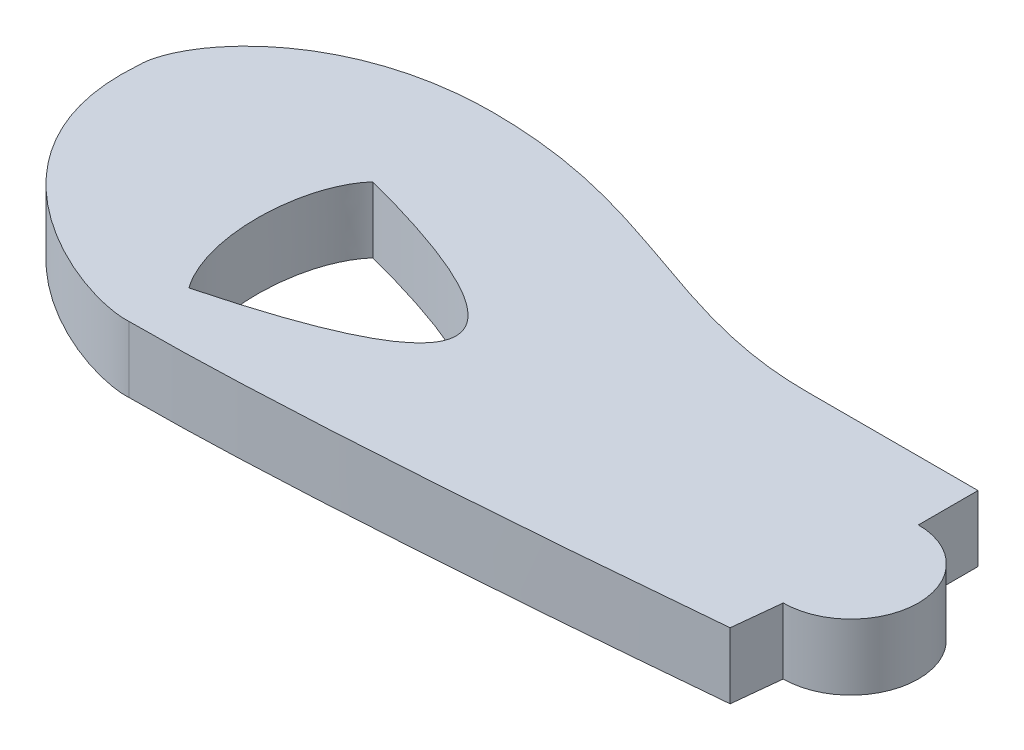
ISO-10303-21;
HEADER;
FILE_DESCRIPTION(('STEP AP214'),'2;1');
FILE_NAME('part.step','',(''),(''),'','','');
FILE_SCHEMA(('AUTOMOTIVE_DESIGN { 1 0 10303 214 1 1 1 1 }'));
ENDSEC;
DATA;
#1=APPLICATION_CONTEXT('core data for automotive mechanical design processes');
#2=APPLICATION_PROTOCOL_DEFINITION('international standard','automotive_design',2000,#1);
#3=PRODUCT_CONTEXT('',#1,'mechanical');
#4=PRODUCT('Part','Part','',(#3));
#5=PRODUCT_RELATED_PRODUCT_CATEGORY('part','',(#4));
#6=PRODUCT_DEFINITION_FORMATION('','',#4);
#7=PRODUCT_DEFINITION_CONTEXT('part definition',#1,'design');
#8=PRODUCT_DEFINITION('design','',#6,#7);
#9=PRODUCT_DEFINITION_SHAPE('','',#8);
#10=(LENGTH_UNIT() NAMED_UNIT(*) SI_UNIT(.MILLI.,.METRE.));
#11=(NAMED_UNIT(*) PLANE_ANGLE_UNIT() SI_UNIT($,.RADIAN.));
#12=(NAMED_UNIT(*) SI_UNIT($,.STERADIAN.) SOLID_ANGLE_UNIT());
#13=UNCERTAINTY_MEASURE_WITH_UNIT(LENGTH_MEASURE(1.E-05),#10,'distance_accuracy_value','');
#14=(GEOMETRIC_REPRESENTATION_CONTEXT(3) GLOBAL_UNCERTAINTY_ASSIGNED_CONTEXT((#13)) GLOBAL_UNIT_ASSIGNED_CONTEXT((#10,
#11,#12)) REPRESENTATION_CONTEXT('',''));
#15=CARTESIAN_POINT('',(0.,0.,0.));
#16=DIRECTION('',(0.,0.,1.));
#17=DIRECTION('',(1.,0.,0.));
#18=AXIS2_PLACEMENT_3D('',#15,#16,#17);
#19=CARTESIAN_POINT('',(-54.0363656247546,0.,-30.75));
#20=DIRECTION('',(0.,1.,0.));
#21=DIRECTION('',(0.,0.,1.));
#22=AXIS2_PLACEMENT_3D('',#19,#20,#21);
#23=PLANE('',#22);
#24=CARTESIAN_POINT('',(-86.5,0.,-13.95));
#25=CARTESIAN_POINT('',(-91.7174686370063,0.,-8.04051707789676));
#26=CARTESIAN_POINT('',(-91.9617677291297,0.,6.4227765229776));
#27=CARTESIAN_POINT('',(-86.5,0.,13.95));
#28=B_SPLINE_CURVE_WITH_KNOTS('',3,(#24,#25,#26,#27),.UNSPECIFIED.,.F.,.F.,(4,4),(0.,1.),.UNSPECIFIED.);
#29=CARTESIAN_POINT('',(-86.5,0.,-13.95));
#30=VERTEX_POINT('',#29);
#31=CARTESIAN_POINT('',(-86.5,0.,13.95));
#32=VERTEX_POINT('',#31);
#33=EDGE_CURVE('E317',#30,#32,#28,.T.);
#34=ORIENTED_EDGE('',*,*,#33,.T.);
#35=CARTESIAN_POINT('',(-86.5,0.,13.95));
#36=CARTESIAN_POINT('',(-33.3474120057159,0.,0.));
#37=CARTESIAN_POINT('',(-86.5,0.,-13.95));
#38=B_SPLINE_CURVE_WITH_KNOTS('',2,(#35,#36,#37),.UNSPECIFIED.,.F.,.F.,(3,3),(0.,1.),.UNSPECIFIED.);
#39=EDGE_CURVE('E308',#32,#30,#38,.T.);
#40=ORIENTED_EDGE('',*,*,#39,.T.);
#41=EDGE_LOOP('',(#34,#40));
#42=FACE_BOUND('',#41,.T.);
#43=CARTESIAN_POINT('',(0.,0.,0.));
#44=DIRECTION('',(0.,1.,0.));
#45=DIRECTION('',(0.,0.,1.));
#46=AXIS2_PLACEMENT_3D('',#43,#44,#45);
#47=CIRCLE('',#46,10.258653745374);
#48=CARTESIAN_POINT('',(0.,0.,-10.258653745374));
#49=VERTEX_POINT('',#48);
#50=CARTESIAN_POINT('',(0.,0.,10.258653745374));
#51=VERTEX_POINT('',#50);
#52=EDGE_CURVE('E121',#49,#51,#47,.F.);
#53=ORIENTED_EDGE('',*,*,#52,.T.);
#54=DIRECTION('',(-0.105174760256228,0.,0.994453754482854));
#55=VECTOR('',#54,1.);
#56=CARTESIAN_POINT('',(3.69141825415091,0.,-24.6446323021882));
#57=LINE('',#56,#55);
#58=CARTESIAN_POINT('',(-0.771119946908726,0.,17.5497863754062));
#59=VERTEX_POINT('',#58);
#60=EDGE_CURVE('E151',#51,#59,#57,.T.);
#61=ORIENTED_EDGE('',*,*,#60,.T.);
#62=CARTESIAN_POINT('',(-86.6437523296419,0.,22.899963035378));
#63=CARTESIAN_POINT('',(-83.0517217367004,0.,22.9018131310767));
#64=CARTESIAN_POINT('',(-79.4638660070371,0.,22.8366548787581));
#65=CARTESIAN_POINT('',(-72.2928525727816,0.,22.6309330547448));
#66=CARTESIAN_POINT('',(-68.709770333769,0.,22.4891582281214));
#67=CARTESIAN_POINT('',(-57.9653495358055,0.,21.9863756751028));
#68=CARTESIAN_POINT('',(-50.8087410518933,0.,21.5494482135542));
#69=CARTESIAN_POINT('',(-36.5025206195082,0.,20.5632958929387));
#70=CARTESIAN_POINT('',(-29.3530301867527,0.,20.0121206544451));
#71=CARTESIAN_POINT('',(-15.0587995532592,0.,18.8335269140399));
#72=CARTESIAN_POINT('',(-7.91409204430113,0.,18.205583695053));
#73=CARTESIAN_POINT('',(-0.771119946908726,0.,17.5497863754062));
#74=B_SPLINE_CURVE_WITH_KNOTS('',3,(#62,#63,#64,#65,#66,#67,#68,#69,#70,#71,#72,#73),
.UNSPECIFIED.,.F.,.F.,(4,2,2,2,2,4),(0.,0.125,0.25,0.5,0.75,1.),.UNSPECIFIED.);
#75=CARTESIAN_POINT('',(-86.6437523296419,0.,22.899963035378));
#76=VERTEX_POINT('',#75);
#77=EDGE_CURVE('E210',#76,#59,#74,.T.);
#78=ORIENTED_EDGE('',*,*,#77,.F.);
#79=CARTESIAN_POINT('',(-119.6,0.,-11.4145006588538));
#80=CARTESIAN_POINT('',(-119.620469876427,0.,-11.1390050484844));
#81=CARTESIAN_POINT('',(-119.640012507043,0.,-10.8635857343478));
#82=CARTESIAN_POINT('',(-119.669498010439,0.,-10.3135369994875));
#83=CARTESIAN_POINT('',(-119.702590259044,0.,-9.489380197204));
#84=CARTESIAN_POINT('',(-119.701746237966,0.,-8.66801576076358));
#85=CARTESIAN_POINT('',(-119.653311171022,0.,-7.02913335646943));
#86=CARTESIAN_POINT('',(-119.558725583157,0.,-5.94167092866437));
#87=CARTESIAN_POINT('',(-119.316814989386,0.,-4.31870820138928));
#88=CARTESIAN_POINT('',(-119.219497862249,0.,-3.77909312166016));
#89=CARTESIAN_POINT('',(-118.990298596528,0.,-2.702707062577));
#90=CARTESIAN_POINT('',(-118.857842253528,0.,-2.1640013236393));
#91=CARTESIAN_POINT('',(-118.411370331997,0.,-0.568296748349267));
#92=CARTESIAN_POINT('',(-118.049576647544,0.,0.46605021053335));
#93=CARTESIAN_POINT('',(-117.204822005017,0.,2.47910341925726));
#94=CARTESIAN_POINT('',(-116.721870667027,0.,3.45781408669583));
#95=CARTESIAN_POINT('',(-115.911016091842,0.,4.88619205137634));
#96=CARTESIAN_POINT('',(-115.626316263348,0.,5.35569860241398));
#97=CARTESIAN_POINT('',(-115.028686616202,0.,6.28174833062));
#98=CARTESIAN_POINT('',(-114.715117794326,0.,6.73902982522674));
#99=CARTESIAN_POINT('',(-113.098128240819,0.,8.96719886231908));
#100=CARTESIAN_POINT('',(-111.636582687157,0.,10.5867548876246));
#101=CARTESIAN_POINT('',(-109.243370011928,0.,12.8211449656596));
#102=CARTESIAN_POINT('',(-108.411754958489,0.,13.5330675968902));
#103=CARTESIAN_POINT('',(-107.116844880896,0.,14.554870600995));
#104=CARTESIAN_POINT('',(-106.676456632741,0.,14.8883332548846));
#105=CARTESIAN_POINT('',(-105.78702555191,0.,15.5353218157448));
#106=CARTESIAN_POINT('',(-105.337421343725,0.,15.8493420497443));
#107=CARTESIAN_POINT('',(-103.066112758064,0.,17.3743128712644));
#108=CARTESIAN_POINT('',(-101.175798147095,0.,18.4522995168088));
#109=CARTESIAN_POINT('',(-98.2375836286283,0.,19.8701683514486));
#110=CARTESIAN_POINT('',(-97.2408445919428,0.,20.3091983019178));
#111=CARTESIAN_POINT('',(-95.2099991893556,0.,21.1148417841863));
#112=CARTESIAN_POINT('',(-94.1746151332158,0.,21.4822453898382));
#113=CARTESIAN_POINT('',(-92.064314635857,0.,22.1267959274164));
#114=CARTESIAN_POINT('',(-91.0010334753599,0.,22.402007075206));
#115=CARTESIAN_POINT('',(-89.3878866327577,0.,22.7093315202254));
#116=CARTESIAN_POINT('',(-88.8471393195822,0.,22.7942246320994));
#117=CARTESIAN_POINT('',(-88.0287511445307,0.,22.8794995676041));
#118=CARTESIAN_POINT('',(-87.7547403977336,0.,22.9008935703289));
#119=CARTESIAN_POINT('',(-87.3408826262683,0.,22.9165362569109));
#120=CARTESIAN_POINT('',(-87.2024530285439,0.,22.918989426892));
#121=CARTESIAN_POINT('',(-86.9242046851596,0.,22.9158549679886));
#122=CARTESIAN_POINT('',(-86.7840063929261,0.,22.9080704113465));
#123=CARTESIAN_POINT('',(-86.643752329642,0.,22.899963035378));
#124=B_SPLINE_CURVE_WITH_KNOTS('',3,(#79,#80,#81,#82,#83,#84,#85,#86,#87,#88,#89,#90,#91,#92,
#93,#94,#95,#96,#97,#98,#99,#100,#101,#102,#103,#104,#105,#106,#107,#108,#109,#110,#111,#112,
#113,#114,#115,#116,#117,#118,#119,#120,#121,#122,#123),.UNSPECIFIED.,.F.,.F.,(4,2,1,2,2,2,2,2,
2,2,2,2,2,2,2,2,2,2,2,2,2,2,4),(0.,0.0156250000000001,0.0312500000000002,0.0625000000000003,
0.125000000000001,0.156250000000001,0.187500000000001,0.250000000000002,0.312500000000002,
0.343750000000002,0.375000000000002,0.500000000000002,0.562500000000002,0.593750000000002,
0.625000000000002,0.75,0.8125,0.875,0.937499999999999,0.968749999999999,0.984374999999999,
0.9921875,1.),.UNSPECIFIED.);
#125=CARTESIAN_POINT('',(-119.6,0.,-11.4145006588538));
#126=VERTEX_POINT('',#125);
#127=EDGE_CURVE('E253',#126,#76,#124,.T.);
#128=ORIENTED_EDGE('',*,*,#127,.F.);
#129=CARTESIAN_POINT('',(-86.5,0.,-32.2));
#130=CARTESIAN_POINT('',(-90.0476717231939,0.,-32.2));
#131=CARTESIAN_POINT('',(-93.5393151087228,0.,-31.8533636211265));
#132=CARTESIAN_POINT('',(-97.818101716006,0.,-30.8894406103892));
#133=CARTESIAN_POINT('',(-98.669522163815,0.,-30.6698246182788));
#134=CARTESIAN_POINT('',(-100.363040921801,0.,-30.1729183897983));
#135=CARTESIAN_POINT('',(-101.20787608864,0.,-29.8946023099045));
#136=CARTESIAN_POINT('',(-103.707194596256,0.,-28.9730152002926));
#137=CARTESIAN_POINT('',(-105.314538731421,0.,-28.2489870700288));
#138=CARTESIAN_POINT('',(-108.402461220943,0.,-26.5648409657757));
#139=CARTESIAN_POINT('',(-109.885156961975,0.,-25.6040404653164));
#140=CARTESIAN_POINT('',(-112.695415045076,0.,-23.4123608346258));
#141=CARTESIAN_POINT('',(-113.98935209218,0.,-22.2093045445709));
#142=CARTESIAN_POINT('',(-115.736354807396,0.,-20.2177499890269));
#143=CARTESIAN_POINT('',(-116.286105674891,0.,-19.5224800740668));
#144=CARTESIAN_POINT('',(-117.30759147323,0.,-18.0567136620487));
#145=CARTESIAN_POINT('',(-117.771937921245,0.,-17.297113036112));
#146=CARTESIAN_POINT('',(-118.380597745587,0.,-16.1122603483252));
#147=CARTESIAN_POINT('',(-118.568848856771,0.,-15.7094991355003));
#148=CARTESIAN_POINT('',(-118.910400222179,0.,-14.8853249845306));
#149=CARTESIAN_POINT('',(-119.063856455615,0.,-14.4629886199802));
#150=CARTESIAN_POINT('',(-119.320990229729,0.,-13.6124416747001));
#151=CARTESIAN_POINT('',(-119.425833719147,0.,-13.1825012006567));
#152=CARTESIAN_POINT('',(-119.534502640605,0.,-12.5280303472006));
#153=CARTESIAN_POINT('',(-119.562552620103,0.,-12.3082655582276));
#154=CARTESIAN_POINT('',(-119.588853411417,0.,-11.9755151889736));
#155=CARTESIAN_POINT('',(-119.594973106296,0.,-11.8640776200213));
#156=CARTESIAN_POINT('',(-119.600932982118,0.,-11.6399671405015));
#157=CARTESIAN_POINT('',(-119.6,0.,-11.5271421289094));
#158=CARTESIAN_POINT('',(-119.6,0.,-11.4145006588538));
#159=B_SPLINE_CURVE_WITH_KNOTS('',3,(#129,#130,#131,#132,#133,#134,#135,#136,#137,#138,#139,
#140,#141,#142,#143,#144,#145,#146,#147,#148,#149,#150,#151,#152,#153,#154,#155,#156,#157,#158),
.UNSPECIFIED.,.F.,.F.,(4,2,2,2,2,2,2,2,2,2,2,2,2,2,4),(0.,0.250000000000001,0.312500000000001,
0.375000000000001,0.500000000000001,0.625,0.75,0.8125,0.874999999999999,0.90625,0.9375,0.96875,
0.984375,0.9921875,1.),.UNSPECIFIED.);
#160=CARTESIAN_POINT('',(-86.5,0.,-32.2));
#161=VERTEX_POINT('',#160);
#162=EDGE_CURVE('E281',#161,#126,#159,.T.);
#163=ORIENTED_EDGE('',*,*,#162,.F.);
#164=CARTESIAN_POINT('',(-26.,0.,-19.3));
#165=CARTESIAN_POINT('',(-28.6143895662839,0.,-19.3));
#166=CARTESIAN_POINT('',(-31.1954800653517,0.,-19.4941263052194));
#167=CARTESIAN_POINT('',(-36.2999180341838,0.,-20.2190081929333));
#168=CARTESIAN_POINT('',(-38.8232365947995,0.,-20.7499323094642));
#169=CARTESIAN_POINT('',(-43.8284462698461,0.,-22.053293525768));
#170=CARTESIAN_POINT('',(-46.313115749791,0.,-22.8261900421633));
#171=CARTESIAN_POINT('',(-51.2443972219442,0.,-24.4703935118145));
#172=CARTESIAN_POINT('',(-53.6940291297999,0.,-25.341112046468));
#173=CARTESIAN_POINT('',(-58.6070691225088,0.,-27.0407125971843));
#174=CARTESIAN_POINT('',(-61.0707228485278,0.,-27.8688486318908));
#175=CARTESIAN_POINT('',(-64.806301572395,0.,-28.9892796867008));
#176=CARTESIAN_POINT('',(-66.0594515216102,0.,-29.3430066223555));
#177=CARTESIAN_POINT('',(-68.5721934612215,0.,-29.9961661128703));
#178=CARTESIAN_POINT('',(-69.8324123166592,0.,-30.2958334790422));
#179=CARTESIAN_POINT('',(-73.6263029310715,0.,-31.1022757269418));
#180=CARTESIAN_POINT('',(-76.1733870661407,0.,-31.5152435196832));
#181=CARTESIAN_POINT('',(-81.3072147372169,0.,-32.0637985033471));
#182=CARTESIAN_POINT('',(-83.8938704408481,0.,-32.2));
#183=CARTESIAN_POINT('',(-86.5,0.,-32.2));
#184=B_SPLINE_CURVE_WITH_KNOTS('',3,(#164,#165,#166,#167,#168,#169,#170,#171,#172,#173,#174,
#175,#176,#177,#178,#179,#180,#181,#182,#183),.UNSPECIFIED.,.F.,.F.,(4,2,2,2,2,2,2,2,2,4),(0.,
0.125,0.25,0.375,0.5,0.625000000000001,0.687500000000001,0.750000000000001,0.875,1.),.UNSPECIFIED.);
#185=CARTESIAN_POINT('',(-26.,0.,-19.3));
#186=VERTEX_POINT('',#185);
#187=EDGE_CURVE('E215',#186,#161,#184,.T.);
#188=ORIENTED_EDGE('',*,*,#187,.F.);
#189=DIRECTION('',(-1.,0.,0.));
#190=VECTOR('',#189,1.);
#191=CARTESIAN_POINT('',(0.,0.,-19.3));
#192=LINE('',#191,#190);
#193=CARTESIAN_POINT('',(0.,0.,-19.3));
#194=VERTEX_POINT('',#193);
#195=EDGE_CURVE('E206',#194,#186,#192,.T.);
#196=ORIENTED_EDGE('',*,*,#195,.F.);
#197=DIRECTION('',(0.,0.,1.));
#198=VECTOR('',#197,1.);
#199=CARTESIAN_POINT('',(0.,0.,-30.75));
#200=LINE('',#199,#198);
#201=EDGE_CURVE('E141',#194,#49,#200,.T.);
#202=ORIENTED_EDGE('',*,*,#201,.T.);
#203=EDGE_LOOP('',(#53,#61,#78,#128,#163,#188,#196,#202));
#204=FACE_BOUND('',#203,.T.);
#205=ADVANCED_FACE('F33',(#42,#204),#23,.F.);
#206=CARTESIAN_POINT('',(-26.,0.,-19.3));
#207=CARTESIAN_POINT('',(-28.6143895662839,0.,-19.3));
#208=CARTESIAN_POINT('',(-31.1954800653517,0.,-19.4941263052194));
#209=CARTESIAN_POINT('',(-36.2999180341838,0.,-20.2190081929333));
#210=CARTESIAN_POINT('',(-38.8232365947995,0.,-20.7499323094642));
#211=CARTESIAN_POINT('',(-43.8284462698461,0.,-22.053293525768));
#212=CARTESIAN_POINT('',(-46.313115749791,0.,-22.8261900421633));
#213=CARTESIAN_POINT('',(-51.2443972219442,0.,-24.4703935118145));
#214=CARTESIAN_POINT('',(-53.6940291297999,0.,-25.341112046468));
#215=CARTESIAN_POINT('',(-58.6070691225088,0.,-27.0407125971843));
#216=CARTESIAN_POINT('',(-61.0707228485278,0.,-27.8688486318908));
#217=CARTESIAN_POINT('',(-64.806301572395,0.,-28.9892796867008));
#218=CARTESIAN_POINT('',(-66.0594515216102,0.,-29.3430066223555));
#219=CARTESIAN_POINT('',(-68.5721934612215,0.,-29.9961661128703));
#220=CARTESIAN_POINT('',(-69.8324123166592,0.,-30.2958334790422));
#221=CARTESIAN_POINT('',(-73.6263029310715,0.,-31.1022757269418));
#222=CARTESIAN_POINT('',(-76.1733870661407,0.,-31.5152435196832));
#223=CARTESIAN_POINT('',(-81.3072147372169,0.,-32.0637985033471));
#224=CARTESIAN_POINT('',(-83.8938704408481,0.,-32.2));
#225=CARTESIAN_POINT('',(-86.5,0.,-32.2));
#226=B_SPLINE_CURVE_WITH_KNOTS('',3,(#206,#207,#208,#209,#210,#211,#212,#213,#214,#215,#216,
#217,#218,#219,#220,#221,#222,#223,#224,#225),.UNSPECIFIED.,.F.,.F.,(4,2,2,2,2,2,2,2,2,4),(0.,
0.125,0.25,0.375,0.5,0.625000000000001,0.687500000000001,0.750000000000001,0.875,1.),.UNSPECIFIED.);
#227=DIRECTION('',(0.,1.,0.));
#228=VECTOR('',#227,1.);
#229=SURFACE_OF_LINEAR_EXTRUSION('',#226,#228);
#230=CARTESIAN_POINT('',(-86.5,10.,-32.2));
#231=CARTESIAN_POINT('',(-83.8938704408481,10.,-32.2));
#232=CARTESIAN_POINT('',(-81.3072147372169,10.,-32.0637985033471));
#233=CARTESIAN_POINT('',(-76.1733870661407,10.,-31.5152435196832));
#234=CARTESIAN_POINT('',(-73.6263029310715,10.,-31.1022757269418));
#235=CARTESIAN_POINT('',(-69.8324123166592,10.,-30.2958334790422));
#236=CARTESIAN_POINT('',(-68.5721934612215,10.,-29.9961661128703));
#237=CARTESIAN_POINT('',(-66.0594515216102,10.,-29.3430066223555));
#238=CARTESIAN_POINT('',(-64.806301572395,10.,-28.9892796867008));
#239=CARTESIAN_POINT('',(-61.0707228485278,10.,-27.8688486318908));
#240=CARTESIAN_POINT('',(-58.6070691225088,10.,-27.0407125971843));
#241=CARTESIAN_POINT('',(-53.6940291297999,10.,-25.341112046468));
#242=CARTESIAN_POINT('',(-51.2443972219442,10.,-24.4703935118145));
#243=CARTESIAN_POINT('',(-46.313115749791,10.,-22.8261900421633));
#244=CARTESIAN_POINT('',(-43.8284462698461,10.,-22.053293525768));
#245=CARTESIAN_POINT('',(-38.8232365947995,10.,-20.7499323094642));
#246=CARTESIAN_POINT('',(-36.2999180341838,10.,-20.2190081929333));
#247=CARTESIAN_POINT('',(-31.1954800653517,10.,-19.4941263052194));
#248=CARTESIAN_POINT('',(-28.6143895662839,10.,-19.3));
#249=CARTESIAN_POINT('',(-26.,10.,-19.3));
#250=B_SPLINE_CURVE_WITH_KNOTS('',3,(#230,#231,#232,#233,#234,#235,#236,#237,#238,#239,#240,
#241,#242,#243,#244,#245,#246,#247,#248,#249),.UNSPECIFIED.,.F.,.F.,(4,2,2,2,2,2,2,2,2,4),(0.,
0.125,0.249999999999999,0.312499999999999,0.374999999999999,0.5,0.625,0.75,0.875,1.),.UNSPECIFIED.);
#251=CARTESIAN_POINT('',(-26.,10.,-19.3));
#252=VERTEX_POINT('',#251);
#253=CARTESIAN_POINT('',(-86.5,10.,-32.2));
#254=VERTEX_POINT('',#253);
#255=EDGE_CURVE('E316',#252,#254,#250,.F.);
#256=ORIENTED_EDGE('',*,*,#255,.F.);
#257=DIRECTION('',(0.,1.,0.));
#258=VECTOR('',#257,1.);
#259=CARTESIAN_POINT('',(-26.,0.,-19.3));
#260=LINE('',#259,#258);
#261=EDGE_CURVE('E11',#186,#252,#260,.T.);
#262=ORIENTED_EDGE('',*,*,#261,.F.);
#263=ORIENTED_EDGE('',*,*,#187,.T.);
#264=DIRECTION('',(0.,1.,0.));
#265=VECTOR('',#264,1.);
#266=CARTESIAN_POINT('',(-86.5,0.,-32.2));
#267=LINE('',#266,#265);
#268=EDGE_CURVE('E209',#161,#254,#267,.T.);
#269=ORIENTED_EDGE('',*,*,#268,.T.);
#270=EDGE_LOOP('',(#256,#262,#263,#269));
#271=FACE_BOUND('',#270,.T.);
#272=ADVANCED_FACE('F178',(#271),#229,.T.);
#273=CARTESIAN_POINT('',(0.,0.,-19.3));
#274=DIRECTION('',(0.,0.,-1.));
#275=DIRECTION('',(-1.,0.,0.));
#276=AXIS2_PLACEMENT_3D('',#273,#274,#275);
#277=PLANE('',#276);
#278=DIRECTION('',(-1.,0.,0.));
#279=VECTOR('',#278,1.);
#280=CARTESIAN_POINT('',(0.,10.,-19.3));
#281=LINE('',#280,#279);
#282=CARTESIAN_POINT('',(0.,10.,-19.3));
#283=VERTEX_POINT('',#282);
#284=EDGE_CURVE('E213',#283,#252,#281,.T.);
#285=ORIENTED_EDGE('',*,*,#284,.F.);
#286=DIRECTION('',(0.,1.,0.));
#287=VECTOR('',#286,1.);
#288=CARTESIAN_POINT('',(0.,0.,-19.3));
#289=LINE('',#288,#287);
#290=EDGE_CURVE('E43',#194,#283,#289,.T.);
#291=ORIENTED_EDGE('',*,*,#290,.F.);
#292=ORIENTED_EDGE('',*,*,#195,.T.);
#293=ORIENTED_EDGE('',*,*,#261,.T.);
#294=EDGE_LOOP('',(#285,#291,#292,#293));
#295=FACE_BOUND('',#294,.T.);
#296=ADVANCED_FACE('F174',(#295),#277,.T.);
#297=CARTESIAN_POINT('',(-86.6437523296419,0.,22.899963035378));
#298=CARTESIAN_POINT('',(-83.0517217367004,0.,22.9018131310767));
#299=CARTESIAN_POINT('',(-79.4638660070371,0.,22.8366548787581));
#300=CARTESIAN_POINT('',(-72.2928525727816,0.,22.6309330547448));
#301=CARTESIAN_POINT('',(-68.709770333769,0.,22.4891582281214));
#302=CARTESIAN_POINT('',(-57.9653495358055,0.,21.9863756751028));
#303=CARTESIAN_POINT('',(-50.8087410518933,0.,21.5494482135542));
#304=CARTESIAN_POINT('',(-36.5025206195082,0.,20.5632958929387));
#305=CARTESIAN_POINT('',(-29.3530301867527,0.,20.0121206544451));
#306=CARTESIAN_POINT('',(-15.0587995532592,0.,18.8335269140399));
#307=CARTESIAN_POINT('',(-7.91409204430113,0.,18.205583695053));
#308=CARTESIAN_POINT('',(-0.771119946908726,0.,17.5497863754062));
#309=B_SPLINE_CURVE_WITH_KNOTS('',3,(#297,#298,#299,#300,#301,#302,#303,#304,#305,#306,#307,
#308),.UNSPECIFIED.,.F.,.F.,(4,2,2,2,2,4),(0.,0.125,0.25,0.5,0.75,1.),.UNSPECIFIED.);
#310=DIRECTION('',(0.,1.,0.));
#311=VECTOR('',#310,1.);
#312=SURFACE_OF_LINEAR_EXTRUSION('',#309,#311);
#313=CARTESIAN_POINT('',(-0.771119946908726,10.,17.5497863754062));
#314=CARTESIAN_POINT('',(-7.91409204430113,10.,18.205583695053));
#315=CARTESIAN_POINT('',(-15.0587995532592,10.,18.8335269140399));
#316=CARTESIAN_POINT('',(-29.3530301867527,10.,20.0121206544451));
#317=CARTESIAN_POINT('',(-36.5025206195082,10.,20.5632958929387));
#318=CARTESIAN_POINT('',(-50.8087410518933,10.,21.5494482135542));
#319=CARTESIAN_POINT('',(-57.9653495358055,10.,21.9863756751028));
#320=CARTESIAN_POINT('',(-68.709770333769,10.,22.4891582281214));
#321=CARTESIAN_POINT('',(-72.2928525727816,10.,22.6309330547448));
#322=CARTESIAN_POINT('',(-79.4638660070371,10.,22.8366548787581));
#323=CARTESIAN_POINT('',(-83.0517217367004,10.,22.9018131310767));
#324=CARTESIAN_POINT('',(-86.6437523296419,10.,22.899963035378));
#325=B_SPLINE_CURVE_WITH_KNOTS('',3,(#313,#314,#315,#316,#317,#318,#319,#320,#321,#322,#323,
#324),.UNSPECIFIED.,.F.,.F.,(4,2,2,2,2,4),(0.,0.25,0.5,0.75,0.875,1.),.UNSPECIFIED.);
#326=CARTESIAN_POINT('',(-86.6437523296419,10.,22.899963035378));
#327=VERTEX_POINT('',#326);
#328=CARTESIAN_POINT('',(-0.771119946908726,10.,17.5497863754062));
#329=VERTEX_POINT('',#328);
#330=EDGE_CURVE('E216',#327,#329,#325,.F.);
#331=ORIENTED_EDGE('',*,*,#330,.F.);
#332=DIRECTION('',(0.,1.,0.));
#333=VECTOR('',#332,1.);
#334=CARTESIAN_POINT('',(-86.6437523296419,0.,22.899963035378));
#335=LINE('',#334,#333);
#336=EDGE_CURVE('E221',#76,#327,#335,.T.);
#337=ORIENTED_EDGE('',*,*,#336,.F.);
#338=ORIENTED_EDGE('',*,*,#77,.T.);
#339=DIRECTION('',(0.,1.,0.));
#340=VECTOR('',#339,1.);
#341=CARTESIAN_POINT('',(-0.771119946908726,0.,17.5497863754062));
#342=LINE('',#341,#340);
#343=EDGE_CURVE('E203',#59,#329,#342,.T.);
#344=ORIENTED_EDGE('',*,*,#343,.T.);
#345=EDGE_LOOP('',(#331,#337,#338,#344));
#346=FACE_BOUND('',#345,.T.);
#347=ADVANCED_FACE('F177',(#346),#312,.T.);
#348=CARTESIAN_POINT('',(-119.6,0.,-11.4145006588538));
#349=CARTESIAN_POINT('',(-119.620469876427,0.,-11.1390050484844));
#350=CARTESIAN_POINT('',(-119.640012507043,0.,-10.8635857343478));
#351=CARTESIAN_POINT('',(-119.669498010439,0.,-10.3135369994875));
#352=CARTESIAN_POINT('',(-119.702590259044,0.,-9.489380197204));
#353=CARTESIAN_POINT('',(-119.701746237966,0.,-8.66801576076358));
#354=CARTESIAN_POINT('',(-119.653311171022,0.,-7.02913335646943));
#355=CARTESIAN_POINT('',(-119.558725583157,0.,-5.94167092866437));
#356=CARTESIAN_POINT('',(-119.316814989386,0.,-4.31870820138928));
#357=CARTESIAN_POINT('',(-119.219497862249,0.,-3.77909312166016));
#358=CARTESIAN_POINT('',(-118.990298596528,0.,-2.702707062577));
#359=CARTESIAN_POINT('',(-118.857842253528,0.,-2.1640013236393));
#360=CARTESIAN_POINT('',(-118.411370331997,0.,-0.568296748349267));
#361=CARTESIAN_POINT('',(-118.049576647544,0.,0.46605021053335));
#362=CARTESIAN_POINT('',(-117.204822005017,0.,2.47910341925726));
#363=CARTESIAN_POINT('',(-116.721870667027,0.,3.45781408669583));
#364=CARTESIAN_POINT('',(-115.911016091842,0.,4.88619205137634));
#365=CARTESIAN_POINT('',(-115.626316263348,0.,5.35569860241398));
#366=CARTESIAN_POINT('',(-115.028686616202,0.,6.28174833062));
#367=CARTESIAN_POINT('',(-114.715117794326,0.,6.73902982522674));
#368=CARTESIAN_POINT('',(-113.098128240819,0.,8.96719886231908));
#369=CARTESIAN_POINT('',(-111.636582687157,0.,10.5867548876246));
#370=CARTESIAN_POINT('',(-109.243370011928,0.,12.8211449656596));
#371=CARTESIAN_POINT('',(-108.411754958489,0.,13.5330675968902));
#372=CARTESIAN_POINT('',(-107.116844880896,0.,14.554870600995));
#373=CARTESIAN_POINT('',(-106.676456632741,0.,14.8883332548846));
#374=CARTESIAN_POINT('',(-105.78702555191,0.,15.5353218157448));
#375=CARTESIAN_POINT('',(-105.337421343725,0.,15.8493420497443));
#376=CARTESIAN_POINT('',(-103.066112758064,0.,17.3743128712644));
#377=CARTESIAN_POINT('',(-101.175798147095,0.,18.4522995168088));
#378=CARTESIAN_POINT('',(-98.2375836286283,0.,19.8701683514486));
#379=CARTESIAN_POINT('',(-97.2408445919428,0.,20.3091983019178));
#380=CARTESIAN_POINT('',(-95.2099991893556,0.,21.1148417841863));
#381=CARTESIAN_POINT('',(-94.1746151332158,0.,21.4822453898382));
#382=CARTESIAN_POINT('',(-92.064314635857,0.,22.1267959274164));
#383=CARTESIAN_POINT('',(-91.0010334753599,0.,22.402007075206));
#384=CARTESIAN_POINT('',(-89.3878866327577,0.,22.7093315202254));
#385=CARTESIAN_POINT('',(-88.8471393195822,0.,22.7942246320994));
#386=CARTESIAN_POINT('',(-88.0287511445307,0.,22.8794995676041));
#387=CARTESIAN_POINT('',(-87.7547403977336,0.,22.9008935703289));
#388=CARTESIAN_POINT('',(-87.3408826262683,0.,22.9165362569109));
#389=CARTESIAN_POINT('',(-87.2024530285439,0.,22.918989426892));
#390=CARTESIAN_POINT('',(-86.9242046851596,0.,22.9158549679886));
#391=CARTESIAN_POINT('',(-86.7840063929261,0.,22.9080704113465));
#392=CARTESIAN_POINT('',(-86.643752329642,0.,22.899963035378));
#393=B_SPLINE_CURVE_WITH_KNOTS('',3,(#348,#349,#350,#351,#352,#353,#354,#355,#356,#357,#358,
#359,#360,#361,#362,#363,#364,#365,#366,#367,#368,#369,#370,#371,#372,#373,#374,#375,#376,#377,
#378,#379,#380,#381,#382,#383,#384,#385,#386,#387,#388,#389,#390,#391,#392),.UNSPECIFIED.,.F.,
.F.,(4,2,1,2,2,2,2,2,2,2,2,2,2,2,2,2,2,2,2,2,2,2,4),(0.,0.0156250000000001,0.0312500000000002,
0.0625000000000003,0.125000000000001,0.156250000000001,0.187500000000001,0.250000000000002,
0.312500000000002,0.343750000000002,0.375000000000002,0.500000000000002,0.562500000000002,
0.593750000000002,0.625000000000002,0.75,0.8125,0.875,0.937499999999999,0.968749999999999,
0.984374999999999,0.9921875,1.),.UNSPECIFIED.);
#394=DIRECTION('',(0.,1.,0.));
#395=VECTOR('',#394,1.);
#396=SURFACE_OF_LINEAR_EXTRUSION('',#393,#395);
#397=CARTESIAN_POINT('',(-86.643752329642,10.,22.899963035378));
#398=CARTESIAN_POINT('',(-86.7840063929261,10.,22.9080704113465));
#399=CARTESIAN_POINT('',(-86.9242046851596,10.,22.9158549679886));
#400=CARTESIAN_POINT('',(-87.2024530285439,10.,22.918989426892));
#401=CARTESIAN_POINT('',(-87.3408826262683,10.,22.9165362569109));
#402=CARTESIAN_POINT('',(-87.7547403977336,10.,22.9008935703289));
#403=CARTESIAN_POINT('',(-88.0287511445307,10.,22.8794995676041));
#404=CARTESIAN_POINT('',(-88.8471393195822,10.,22.7942246320994));
#405=CARTESIAN_POINT('',(-89.3878866327577,10.,22.7093315202254));
#406=CARTESIAN_POINT('',(-91.0010334753599,10.,22.402007075206));
#407=CARTESIAN_POINT('',(-92.064314635857,10.,22.1267959274164));
#408=CARTESIAN_POINT('',(-94.1746151332158,10.,21.4822453898382));
#409=CARTESIAN_POINT('',(-95.2099991893556,10.,21.1148417841863));
#410=CARTESIAN_POINT('',(-97.2408445919428,10.,20.3091983019178));
#411=CARTESIAN_POINT('',(-98.2375836286283,10.,19.8701683514486));
#412=CARTESIAN_POINT('',(-101.175798147095,10.,18.4522995168088));
#413=CARTESIAN_POINT('',(-103.066112758064,10.,17.3743128712644));
#414=CARTESIAN_POINT('',(-105.337421343725,10.,15.8493420497443));
#415=CARTESIAN_POINT('',(-105.78702555191,10.,15.5353218157448));
#416=CARTESIAN_POINT('',(-106.676456632741,10.,14.8883332548846));
#417=CARTESIAN_POINT('',(-107.116844880896,10.,14.554870600995));
#418=CARTESIAN_POINT('',(-108.411754958489,10.,13.5330675968902));
#419=CARTESIAN_POINT('',(-109.243370011928,10.,12.8211449656596));
#420=CARTESIAN_POINT('',(-111.636582687157,10.,10.5867548876246));
#421=CARTESIAN_POINT('',(-113.098128240819,10.,8.96719886231908));
#422=CARTESIAN_POINT('',(-114.715117794326,10.,6.73902982522674));
#423=CARTESIAN_POINT('',(-115.028686616202,10.,6.28174833062));
#424=CARTESIAN_POINT('',(-115.626316263348,10.,5.35569860241398));
#425=CARTESIAN_POINT('',(-115.911016091842,10.,4.88619205137634));
#426=CARTESIAN_POINT('',(-116.721870667027,10.,3.45781408669583));
#427=CARTESIAN_POINT('',(-117.204822005017,10.,2.47910341925726));
#428=CARTESIAN_POINT('',(-118.049576647544,10.,0.46605021053335));
#429=CARTESIAN_POINT('',(-118.411370331997,10.,-0.568296748349267));
#430=CARTESIAN_POINT('',(-118.857842253528,10.,-2.1640013236393));
#431=CARTESIAN_POINT('',(-118.990298596528,10.,-2.702707062577));
#432=CARTESIAN_POINT('',(-119.219497862249,10.,-3.77909312166016));
#433=CARTESIAN_POINT('',(-119.316814989386,10.,-4.31870820138928));
#434=CARTESIAN_POINT('',(-119.558725583157,10.,-5.94167092866437));
#435=CARTESIAN_POINT('',(-119.653311171022,10.,-7.02913335646943));
#436=CARTESIAN_POINT('',(-119.701746237966,10.,-8.66801576076358));
#437=CARTESIAN_POINT('',(-119.702590259044,10.,-9.489380197204));
#438=CARTESIAN_POINT('',(-119.669498010439,10.,-10.3135369994875));
#439=CARTESIAN_POINT('',(-119.640012507043,10.,-10.8635857343478));
#440=CARTESIAN_POINT('',(-119.620469876427,10.,-11.1390050484844));
#441=CARTESIAN_POINT('',(-119.6,10.,-11.4145006588538));
#442=B_SPLINE_CURVE_WITH_KNOTS('',3,(#397,#398,#399,#400,#401,#402,#403,#404,#405,#406,#407,
#408,#409,#410,#411,#412,#413,#414,#415,#416,#417,#418,#419,#420,#421,#422,#423,#424,#425,#426,
#427,#428,#429,#430,#431,#432,#433,#434,#435,#436,#437,#438,#439,#440,#441),.UNSPECIFIED.,.F.,
.F.,(4,2,2,2,2,2,2,2,2,2,2,2,2,2,2,2,2,2,2,2,1,2,4),(0.,0.00781250000000044,0.015625000000001,
0.031250000000001,0.0625000000000006,0.125,0.1875,0.25,0.374999999999998,0.406249999999998,
0.437499999999998,0.499999999999998,0.624999999999998,0.656249999999998,0.687499999999998,
0.749999999999998,0.812499999999999,0.843749999999999,0.874999999999999,0.9375,0.96875,0.984375,
1.),.UNSPECIFIED.);
#443=CARTESIAN_POINT('',(-119.6,10.,-11.4145006588538));
#444=VERTEX_POINT('',#443);
#445=EDGE_CURVE('E267',#444,#327,#442,.F.);
#446=ORIENTED_EDGE('',*,*,#445,.F.);
#447=DIRECTION('',(0.,1.,0.));
#448=VECTOR('',#447,1.);
#449=CARTESIAN_POINT('',(-119.6,0.,-11.4145006588538));
#450=LINE('',#449,#448);
#451=EDGE_CURVE('E235',#126,#444,#450,.T.);
#452=ORIENTED_EDGE('',*,*,#451,.F.);
#453=ORIENTED_EDGE('',*,*,#127,.T.);
#454=ORIENTED_EDGE('',*,*,#336,.T.);
#455=EDGE_LOOP('',(#446,#452,#453,#454));
#456=FACE_BOUND('',#455,.T.);
#457=ADVANCED_FACE('F184',(#456),#396,.T.);
#458=CARTESIAN_POINT('',(-86.5,0.,-32.2));
#459=CARTESIAN_POINT('',(-90.0476717231939,0.,-32.2));
#460=CARTESIAN_POINT('',(-93.5393151087228,0.,-31.8533636211265));
#461=CARTESIAN_POINT('',(-97.818101716006,0.,-30.8894406103892));
#462=CARTESIAN_POINT('',(-98.669522163815,0.,-30.6698246182788));
#463=CARTESIAN_POINT('',(-100.363040921801,0.,-30.1729183897983));
#464=CARTESIAN_POINT('',(-101.20787608864,0.,-29.8946023099045));
#465=CARTESIAN_POINT('',(-103.707194596256,0.,-28.9730152002926));
#466=CARTESIAN_POINT('',(-105.314538731421,0.,-28.2489870700288));
#467=CARTESIAN_POINT('',(-108.402461220943,0.,-26.5648409657757));
#468=CARTESIAN_POINT('',(-109.885156961975,0.,-25.6040404653164));
#469=CARTESIAN_POINT('',(-112.695415045076,0.,-23.4123608346258));
#470=CARTESIAN_POINT('',(-113.98935209218,0.,-22.2093045445709));
#471=CARTESIAN_POINT('',(-115.736354807396,0.,-20.2177499890269));
#472=CARTESIAN_POINT('',(-116.286105674891,0.,-19.5224800740668));
#473=CARTESIAN_POINT('',(-117.30759147323,0.,-18.0567136620487));
#474=CARTESIAN_POINT('',(-117.771937921245,0.,-17.297113036112));
#475=CARTESIAN_POINT('',(-118.380597745587,0.,-16.1122603483252));
#476=CARTESIAN_POINT('',(-118.568848856771,0.,-15.7094991355003));
#477=CARTESIAN_POINT('',(-118.910400222179,0.,-14.8853249845306));
#478=CARTESIAN_POINT('',(-119.063856455615,0.,-14.4629886199802));
#479=CARTESIAN_POINT('',(-119.320990229729,0.,-13.6124416747001));
#480=CARTESIAN_POINT('',(-119.425833719147,0.,-13.1825012006567));
#481=CARTESIAN_POINT('',(-119.534502640605,0.,-12.5280303472006));
#482=CARTESIAN_POINT('',(-119.562552620103,0.,-12.3082655582276));
#483=CARTESIAN_POINT('',(-119.588853411417,0.,-11.9755151889736));
#484=CARTESIAN_POINT('',(-119.594973106296,0.,-11.8640776200213));
#485=CARTESIAN_POINT('',(-119.600932982118,0.,-11.6399671405015));
#486=CARTESIAN_POINT('',(-119.6,0.,-11.5271421289094));
#487=CARTESIAN_POINT('',(-119.6,0.,-11.4145006588538));
#488=B_SPLINE_CURVE_WITH_KNOTS('',3,(#458,#459,#460,#461,#462,#463,#464,#465,#466,#467,#468,
#469,#470,#471,#472,#473,#474,#475,#476,#477,#478,#479,#480,#481,#482,#483,#484,#485,#486,#487),
.UNSPECIFIED.,.F.,.F.,(4,2,2,2,2,2,2,2,2,2,2,2,2,2,4),(0.,0.250000000000001,0.312500000000001,
0.375000000000001,0.500000000000001,0.625,0.75,0.8125,0.874999999999999,0.90625,0.9375,0.96875,
0.984375,0.9921875,1.),.UNSPECIFIED.);
#489=DIRECTION('',(0.,1.,0.));
#490=VECTOR('',#489,1.);
#491=SURFACE_OF_LINEAR_EXTRUSION('',#488,#490);
#492=CARTESIAN_POINT('',(-119.6,10.,-11.4145006588538));
#493=CARTESIAN_POINT('',(-119.6,10.,-11.5271421289094));
#494=CARTESIAN_POINT('',(-119.600932982118,10.,-11.6399671405015));
#495=CARTESIAN_POINT('',(-119.594973106296,10.,-11.8640776200213));
#496=CARTESIAN_POINT('',(-119.588853411417,10.,-11.9755151889736));
#497=CARTESIAN_POINT('',(-119.562552620103,10.,-12.3082655582276));
#498=CARTESIAN_POINT('',(-119.534502640605,10.,-12.5280303472006));
#499=CARTESIAN_POINT('',(-119.425833719147,10.,-13.1825012006567));
#500=CARTESIAN_POINT('',(-119.320990229729,10.,-13.6124416747001));
#501=CARTESIAN_POINT('',(-119.063856455615,10.,-14.4629886199802));
#502=CARTESIAN_POINT('',(-118.910400222179,10.,-14.8853249845306));
#503=CARTESIAN_POINT('',(-118.568848856771,10.,-15.7094991355003));
#504=CARTESIAN_POINT('',(-118.380597745587,10.,-16.1122603483252));
#505=CARTESIAN_POINT('',(-117.771937921245,10.,-17.297113036112));
#506=CARTESIAN_POINT('',(-117.30759147323,10.,-18.0567136620487));
#507=CARTESIAN_POINT('',(-116.286105674891,10.,-19.5224800740668));
#508=CARTESIAN_POINT('',(-115.736354807396,10.,-20.2177499890269));
#509=CARTESIAN_POINT('',(-113.98935209218,10.,-22.2093045445709));
#510=CARTESIAN_POINT('',(-112.695415045076,10.,-23.4123608346258));
#511=CARTESIAN_POINT('',(-109.885156961975,10.,-25.6040404653164));
#512=CARTESIAN_POINT('',(-108.402461220943,10.,-26.5648409657757));
#513=CARTESIAN_POINT('',(-105.314538731421,10.,-28.2489870700288));
#514=CARTESIAN_POINT('',(-103.707194596256,10.,-28.9730152002926));
#515=CARTESIAN_POINT('',(-101.20787608864,10.,-29.8946023099045));
#516=CARTESIAN_POINT('',(-100.363040921801,10.,-30.1729183897983));
#517=CARTESIAN_POINT('',(-98.669522163815,10.,-30.6698246182788));
#518=CARTESIAN_POINT('',(-97.818101716006,10.,-30.8894406103892));
#519=CARTESIAN_POINT('',(-93.5393151087228,10.,-31.8533636211265));
#520=CARTESIAN_POINT('',(-90.0476717231939,10.,-32.2));
#521=CARTESIAN_POINT('',(-86.5,10.,-32.2));
#522=B_SPLINE_CURVE_WITH_KNOTS('',3,(#492,#493,#494,#495,#496,#497,#498,#499,#500,#501,#502,
#503,#504,#505,#506,#507,#508,#509,#510,#511,#512,#513,#514,#515,#516,#517,#518,#519,#520,#521),
.UNSPECIFIED.,.F.,.F.,(4,2,2,2,2,2,2,2,2,2,2,2,2,2,4),(0.,0.0078125,0.0156250000000001,
0.0312500000000002,0.0625000000000003,0.0937500000000003,0.125000000000001,0.1875,0.25,0.375,
0.499999999999999,0.624999999999999,0.687499999999999,0.749999999999999,1.),.UNSPECIFIED.);
#523=EDGE_CURVE('E364',#254,#444,#522,.F.);
#524=ORIENTED_EDGE('',*,*,#523,.F.);
#525=ORIENTED_EDGE('',*,*,#268,.F.);
#526=ORIENTED_EDGE('',*,*,#162,.T.);
#527=ORIENTED_EDGE('',*,*,#451,.T.);
#528=EDGE_LOOP('',(#524,#525,#526,#527));
#529=FACE_BOUND('',#528,.T.);
#530=ADVANCED_FACE('F286',(#529),#491,.T.);
#531=CARTESIAN_POINT('',(-54.0363656247546,10.,-30.75));
#532=DIRECTION('',(0.,1.,0.));
#533=DIRECTION('',(0.,0.,1.));
#534=AXIS2_PLACEMENT_3D('',#531,#532,#533);
#535=PLANE('',#534);
#536=DIRECTION('',(-0.105174760256228,0.,0.994453754482854));
#537=VECTOR('',#536,1.);
#538=CARTESIAN_POINT('',(0.,10.,10.258653745374));
#539=LINE('',#538,#537);
#540=CARTESIAN_POINT('',(0.,10.,10.258653745374));
#541=VERTEX_POINT('',#540);
#542=EDGE_CURVE('E125',#541,#329,#539,.T.);
#543=ORIENTED_EDGE('',*,*,#542,.F.);
#544=CARTESIAN_POINT('',(0.,10.,0.));
#545=DIRECTION('',(0.,-1.,0.));
#546=DIRECTION('',(0.,0.,-1.));
#547=AXIS2_PLACEMENT_3D('',#544,#545,#546);
#548=CIRCLE('',#547,10.258653745374);
#549=CARTESIAN_POINT('',(0.,10.,-10.258653745374));
#550=VERTEX_POINT('',#549);
#551=EDGE_CURVE('E118',#550,#541,#548,.T.);
#552=ORIENTED_EDGE('',*,*,#551,.F.);
#553=DIRECTION('',(0.,0.,1.));
#554=VECTOR('',#553,1.);
#555=CARTESIAN_POINT('',(0.,10.,-19.3));
#556=LINE('',#555,#554);
#557=EDGE_CURVE('E128',#283,#550,#556,.T.);
#558=ORIENTED_EDGE('',*,*,#557,.F.);
#559=ORIENTED_EDGE('',*,*,#284,.T.);
#560=ORIENTED_EDGE('',*,*,#255,.T.);
#561=ORIENTED_EDGE('',*,*,#523,.T.);
#562=ORIENTED_EDGE('',*,*,#445,.T.);
#563=ORIENTED_EDGE('',*,*,#330,.T.);
#564=EDGE_LOOP('',(#543,#552,#558,#559,#560,#561,#562,#563));
#565=FACE_BOUND('',#564,.T.);
#566=CARTESIAN_POINT('',(-86.5,10.,13.95));
#567=CARTESIAN_POINT('',(-33.3474120057159,10.,0.));
#568=CARTESIAN_POINT('',(-86.5,10.,-13.95));
#569=B_SPLINE_CURVE_WITH_KNOTS('',2,(#566,#567,#568),.UNSPECIFIED.,.F.,.F.,(3,3),(0.,1.),.UNSPECIFIED.);
#570=CARTESIAN_POINT('',(-86.5,10.,13.95));
#571=VERTEX_POINT('',#570);
#572=CARTESIAN_POINT('',(-86.5,10.,-13.95));
#573=VERTEX_POINT('',#572);
#574=EDGE_CURVE('E58',#571,#573,#569,.T.);
#575=ORIENTED_EDGE('',*,*,#574,.F.);
#576=CARTESIAN_POINT('',(-86.5,10.,-13.95));
#577=CARTESIAN_POINT('',(-91.7174686370063,10.,-8.04051707789676));
#578=CARTESIAN_POINT('',(-91.9617677291297,10.,6.4227765229776));
#579=CARTESIAN_POINT('',(-86.5,10.,13.95));
#580=B_SPLINE_CURVE_WITH_KNOTS('',3,(#576,#577,#578,#579),.UNSPECIFIED.,.F.,.F.,(4,4),(0.,1.),.UNSPECIFIED.);
#581=EDGE_CURVE('E330',#573,#571,#580,.T.);
#582=ORIENTED_EDGE('',*,*,#581,.F.);
#583=EDGE_LOOP('',(#575,#582));
#584=FACE_BOUND('',#583,.T.);
#585=ADVANCED_FACE('F135',(#565,#584),#535,.T.);
#586=CARTESIAN_POINT('',(-86.5,-0.25,13.95));
#587=CARTESIAN_POINT('',(-33.3474120057159,-0.25,0.));
#588=CARTESIAN_POINT('',(-86.5,-0.25,-13.95));
#589=B_SPLINE_CURVE_WITH_KNOTS('',2,(#586,#587,#588),.UNSPECIFIED.,.F.,.F.,(3,3),(0.,1.),.UNSPECIFIED.);
#590=DIRECTION('',(0.,1.,0.));
#591=VECTOR('',#590,1.);
#592=SURFACE_OF_LINEAR_EXTRUSION('',#589,#591);
#593=DIRECTION('',(0.,1.,0.));
#594=VECTOR('',#593,1.);
#595=CARTESIAN_POINT('',(-86.5,-0.25,13.95));
#596=LINE('',#595,#594);
#597=EDGE_CURVE('E51',#32,#571,#596,.T.);
#598=ORIENTED_EDGE('',*,*,#597,.T.);
#599=ORIENTED_EDGE('',*,*,#574,.T.);
#600=DIRECTION('',(0.,1.,0.));
#601=VECTOR('',#600,1.);
#602=CARTESIAN_POINT('',(-86.5,-0.25,-13.95));
#603=LINE('',#602,#601);
#604=EDGE_CURVE('E325',#30,#573,#603,.T.);
#605=ORIENTED_EDGE('',*,*,#604,.F.);
#606=ORIENTED_EDGE('',*,*,#39,.F.);
#607=EDGE_LOOP('',(#598,#599,#605,#606));
#608=FACE_BOUND('',#607,.T.);
#609=ADVANCED_FACE('F168',(#608),#592,.F.);
#610=CARTESIAN_POINT('',(-86.5,-0.25,-13.95));
#611=CARTESIAN_POINT('',(-91.7174686370063,-0.25,-8.04051707789676));
#612=CARTESIAN_POINT('',(-91.9617677291297,-0.25,6.4227765229776));
#613=CARTESIAN_POINT('',(-86.5,-0.25,13.95));
#614=B_SPLINE_CURVE_WITH_KNOTS('',3,(#610,#611,#612,#613),.UNSPECIFIED.,.F.,.F.,(4,4),(0.,1.),.UNSPECIFIED.);
#615=DIRECTION('',(0.,1.,0.));
#616=VECTOR('',#615,1.);
#617=SURFACE_OF_LINEAR_EXTRUSION('',#614,#616);
#618=ORIENTED_EDGE('',*,*,#604,.T.);
#619=ORIENTED_EDGE('',*,*,#581,.T.);
#620=ORIENTED_EDGE('',*,*,#597,.F.);
#621=ORIENTED_EDGE('',*,*,#33,.F.);
#622=EDGE_LOOP('',(#618,#619,#620,#621));
#623=FACE_BOUND('',#622,.T.);
#624=ADVANCED_FACE('F172',(#623),#617,.F.);
#625=CARTESIAN_POINT('',(0.,-0.25,10.258653745374));
#626=DIRECTION('',(-0.994453754482854,0.,-0.105174760256228));
#627=DIRECTION('',(-0.105174760256228,0.,0.994453754482854));
#628=AXIS2_PLACEMENT_3D('',#625,#626,#627);
#629=PLANE('',#628);
#630=DIRECTION('',(0.,1.,0.));
#631=VECTOR('',#630,1.);
#632=CARTESIAN_POINT('',(0.,-0.25,10.258653745374));
#633=LINE('',#632,#631);
#634=EDGE_CURVE('E124',#51,#541,#633,.T.);
#635=ORIENTED_EDGE('',*,*,#634,.T.);
#636=ORIENTED_EDGE('',*,*,#542,.T.);
#637=ORIENTED_EDGE('',*,*,#343,.F.);
#638=ORIENTED_EDGE('',*,*,#60,.F.);
#639=EDGE_LOOP('',(#635,#636,#637,#638));
#640=FACE_BOUND('',#639,.T.);
#641=ADVANCED_FACE('F475',(#640),#629,.F.);
#642=CARTESIAN_POINT('',(0.,-0.25,0.));
#643=DIRECTION('',(0.,1.,0.));
#644=DIRECTION('',(0.,0.,1.));
#645=AXIS2_PLACEMENT_3D('',#642,#643,#644);
#646=CYLINDRICAL_SURFACE('',#645,10.258653745374);
#647=DIRECTION('',(0.,1.,0.));
#648=VECTOR('',#647,1.);
#649=CARTESIAN_POINT('',(0.,-0.25,-10.258653745374));
#650=LINE('',#649,#648);
#651=EDGE_CURVE('E113',#49,#550,#650,.T.);
#652=ORIENTED_EDGE('',*,*,#651,.T.);
#653=ORIENTED_EDGE('',*,*,#551,.T.);
#654=ORIENTED_EDGE('',*,*,#634,.F.);
#655=ORIENTED_EDGE('',*,*,#52,.F.);
#656=EDGE_LOOP('',(#652,#653,#654,#655));
#657=FACE_BOUND('',#656,.T.);
#658=ADVANCED_FACE('F115',(#657),#646,.T.);
#659=CARTESIAN_POINT('',(0.,-0.25,-19.3));
#660=DIRECTION('',(-1.,0.,0.));
#661=DIRECTION('',(0.,0.,1.));
#662=AXIS2_PLACEMENT_3D('',#659,#660,#661);
#663=PLANE('',#662);
#664=ORIENTED_EDGE('',*,*,#290,.T.);
#665=ORIENTED_EDGE('',*,*,#557,.T.);
#666=ORIENTED_EDGE('',*,*,#651,.F.);
#667=ORIENTED_EDGE('',*,*,#201,.F.);
#668=EDGE_LOOP('',(#664,#665,#666,#667));
#669=FACE_BOUND('',#668,.T.);
#670=ADVANCED_FACE('F129',(#669),#663,.F.);
#671=CLOSED_SHELL('',(#205,#272,#296,#347,#457,#530,#585,#609,#624,#641,#658,#670));
#672=MANIFOLD_SOLID_BREP('B2',#671);
#673=ADVANCED_BREP_SHAPE_REPRESENTATION('',(#18,#672),#14);
#674=SHAPE_DEFINITION_REPRESENTATION(#9,#673);
ENDSEC;
END-ISO-10303-21;
